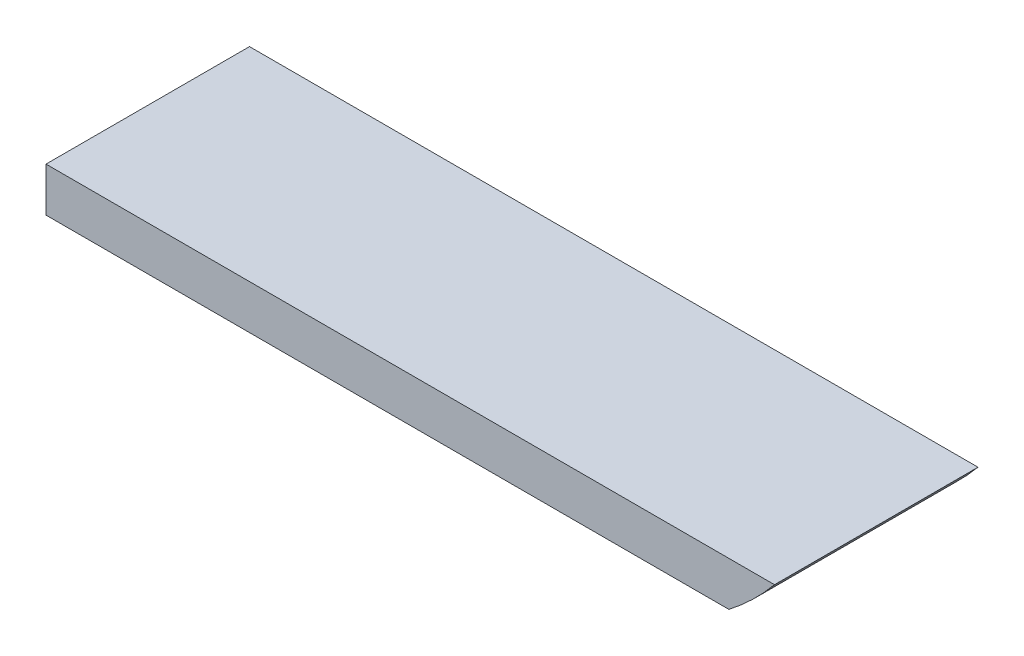
ISO-10303-21;
HEADER;
FILE_DESCRIPTION(('STEP AP214'),'2;1');
FILE_NAME('part.step','',(''),(''),'','','');
FILE_SCHEMA(('AUTOMOTIVE_DESIGN { 1 0 10303 214 1 1 1 1 }'));
ENDSEC;
DATA;
#1=APPLICATION_CONTEXT('core data for automotive mechanical design processes');
#2=APPLICATION_PROTOCOL_DEFINITION('international standard','automotive_design',2000,#1);
#3=PRODUCT_CONTEXT('',#1,'mechanical');
#4=PRODUCT('Part','Part','',(#3));
#5=PRODUCT_RELATED_PRODUCT_CATEGORY('part','',(#4));
#6=PRODUCT_DEFINITION_FORMATION('','',#4);
#7=PRODUCT_DEFINITION_CONTEXT('part definition',#1,'design');
#8=PRODUCT_DEFINITION('design','',#6,#7);
#9=PRODUCT_DEFINITION_SHAPE('','',#8);
#10=(LENGTH_UNIT() NAMED_UNIT(*) SI_UNIT(.MILLI.,.METRE.));
#11=(NAMED_UNIT(*) PLANE_ANGLE_UNIT() SI_UNIT($,.RADIAN.));
#12=(NAMED_UNIT(*) SI_UNIT($,.STERADIAN.) SOLID_ANGLE_UNIT());
#13=UNCERTAINTY_MEASURE_WITH_UNIT(LENGTH_MEASURE(1.E-05),#10,'distance_accuracy_value','');
#14=(GEOMETRIC_REPRESENTATION_CONTEXT(3) GLOBAL_UNCERTAINTY_ASSIGNED_CONTEXT((#13)) GLOBAL_UNIT_ASSIGNED_CONTEXT((#10,
#11,#12)) REPRESENTATION_CONTEXT('',''));
#15=CARTESIAN_POINT('',(0.,0.,0.));
#16=DIRECTION('',(0.,0.,1.));
#17=DIRECTION('',(1.,0.,0.));
#18=AXIS2_PLACEMENT_3D('',#15,#16,#17);
#19=CARTESIAN_POINT('',(-27.120912466168,5.900026226117,0.));
#20=DIRECTION('',(0.,-1.,0.));
#21=DIRECTION('',(1.,0.,0.));
#22=AXIS2_PLACEMENT_3D('',#19,#20,#21);
#23=PLANE('',#22);
#24=DIRECTION('',(-1.,0.,0.));
#25=VECTOR('',#24,1.);
#26=CARTESIAN_POINT('',(-26.785327658729,5.900026226117,0.));
#27=LINE('',#26,#25);
#28=CARTESIAN_POINT('',(-26.785327658729,5.900026226117,0.));
#29=VERTEX_POINT('',#28);
#30=CARTESIAN_POINT('',(-27.120912466168,5.900026226117,0.));
#31=VERTEX_POINT('',#30);
#32=EDGE_CURVE('E11',#29,#31,#27,.T.);
#33=ORIENTED_EDGE('',*,*,#32,.F.);
#34=DIRECTION('',(0.,0.,1.));
#35=VECTOR('',#34,1.);
#36=CARTESIAN_POINT('',(-26.785327658729,5.900026226117,0.));
#37=LINE('',#36,#35);
#38=CARTESIAN_POINT('',(-26.785327658729,5.900026226117,0.1));
#39=VERTEX_POINT('',#38);
#40=EDGE_CURVE('E24',#29,#39,#37,.T.);
#41=ORIENTED_EDGE('',*,*,#40,.T.);
#42=DIRECTION('',(1.,0.,0.));
#43=VECTOR('',#42,1.);
#44=CARTESIAN_POINT('',(-26.785327658729,5.900026226117,0.1));
#45=LINE('',#44,#43);
#46=CARTESIAN_POINT('',(-27.120912466168,5.900026226117,0.1));
#47=VERTEX_POINT('',#46);
#48=EDGE_CURVE('E75',#47,#39,#45,.T.);
#49=ORIENTED_EDGE('',*,*,#48,.F.);
#50=DIRECTION('',(0.,0.,1.));
#51=VECTOR('',#50,1.);
#52=CARTESIAN_POINT('',(-27.120912466168,5.900026226117,0.));
#53=LINE('',#52,#51);
#54=EDGE_CURVE('E85',#31,#47,#53,.T.);
#55=ORIENTED_EDGE('',*,*,#54,.F.);
#56=EDGE_LOOP('',(#33,#41,#49,#55));
#57=FACE_BOUND('',#56,.T.);
#58=ADVANCED_FACE('F17',(#57),#23,.T.);
#59=CARTESIAN_POINT('',(-27.120912466168,5.921755362914,0.));
#60=DIRECTION('',(-1.,0.,0.));
#61=DIRECTION('',(0.,-1.,0.));
#62=AXIS2_PLACEMENT_3D('',#59,#60,#61);
#63=PLANE('',#62);
#64=DIRECTION('',(0.,1.,0.));
#65=VECTOR('',#64,1.);
#66=CARTESIAN_POINT('',(-27.120912466168,5.900026226117,0.));
#67=LINE('',#66,#65);
#68=CARTESIAN_POINT('',(-27.120912466168,5.921755362914,0.));
#69=VERTEX_POINT('',#68);
#70=EDGE_CURVE('E83',#31,#69,#67,.T.);
#71=ORIENTED_EDGE('',*,*,#70,.F.);
#72=ORIENTED_EDGE('',*,*,#54,.T.);
#73=DIRECTION('',(0.,-1.,0.));
#74=VECTOR('',#73,1.);
#75=CARTESIAN_POINT('',(-27.120912466168,5.900026226117,0.1));
#76=LINE('',#75,#74);
#77=CARTESIAN_POINT('',(-27.120912466168,5.921755362914,0.1));
#78=VERTEX_POINT('',#77);
#79=EDGE_CURVE('E81',#78,#47,#76,.T.);
#80=ORIENTED_EDGE('',*,*,#79,.F.);
#81=DIRECTION('',(0.,0.,1.));
#82=VECTOR('',#81,1.);
#83=CARTESIAN_POINT('',(-27.120912466168,5.921755362914,0.));
#84=LINE('',#83,#82);
#85=EDGE_CURVE('E61',#69,#78,#84,.T.);
#86=ORIENTED_EDGE('',*,*,#85,.F.);
#87=EDGE_LOOP('',(#71,#72,#80,#86));
#88=FACE_BOUND('',#87,.T.);
#89=ADVANCED_FACE('F91',(#88),#63,.T.);
#90=CARTESIAN_POINT('',(-26.762905966638,5.921755362914,0.));
#91=DIRECTION('',(0.,1.,0.));
#92=DIRECTION('',(-1.,0.,0.));
#93=AXIS2_PLACEMENT_3D('',#90,#91,#92);
#94=PLANE('',#93);
#95=DIRECTION('',(1.,0.,0.));
#96=VECTOR('',#95,1.);
#97=CARTESIAN_POINT('',(-27.120912466168,5.921755362914,0.));
#98=LINE('',#97,#96);
#99=CARTESIAN_POINT('',(-26.762905966638,5.921755362914,0.));
#100=VERTEX_POINT('',#99);
#101=EDGE_CURVE('E65',#69,#100,#98,.T.);
#102=ORIENTED_EDGE('',*,*,#101,.F.);
#103=ORIENTED_EDGE('',*,*,#85,.T.);
#104=DIRECTION('',(-1.,0.,0.));
#105=VECTOR('',#104,1.);
#106=CARTESIAN_POINT('',(-27.120912466168,5.921755362914,0.1));
#107=LINE('',#106,#105);
#108=CARTESIAN_POINT('',(-26.762905966638,5.921755362914,0.1));
#109=VERTEX_POINT('',#108);
#110=EDGE_CURVE('E54',#109,#78,#107,.T.);
#111=ORIENTED_EDGE('',*,*,#110,.F.);
#112=DIRECTION('',(0.,0.,1.));
#113=VECTOR('',#112,1.);
#114=CARTESIAN_POINT('',(-26.762905966638,5.921755362914,0.));
#115=LINE('',#114,#113);
#116=EDGE_CURVE('E58',#100,#109,#115,.T.);
#117=ORIENTED_EDGE('',*,*,#116,.F.);
#118=EDGE_LOOP('',(#102,#103,#111,#117));
#119=FACE_BOUND('',#118,.T.);
#120=ADVANCED_FACE('F57',(#119),#94,.T.);
#121=CARTESIAN_POINT('',(-26.871812170946,6.011699918327,0.));
#122=DIRECTION('',(0.,0.,1.));
#123=DIRECTION('',(-0.612294741404356,0.790629590673517,0.));
#124=AXIS2_PLACEMENT_3D('',#121,#122,#123);
#125=CYLINDRICAL_SURFACE('',#124,0.141246537604029);
#126=CARTESIAN_POINT('',(-26.871812170946,6.011699918327,0.));
#127=DIRECTION('',(0.,0.,-1.));
#128=DIRECTION('',(-0.612294741404356,0.790629590673517,0.));
#129=AXIS2_PLACEMENT_3D('',#126,#127,#128);
#130=CIRCLE('',#129,0.141246537604029);
#131=EDGE_CURVE('E71',#100,#29,#130,.T.);
#132=ORIENTED_EDGE('',*,*,#131,.F.);
#133=ORIENTED_EDGE('',*,*,#116,.T.);
#134=CARTESIAN_POINT('',(-26.871812170946,6.011699918327,0.1));
#135=DIRECTION('',(0.,0.,1.));
#136=DIRECTION('',(-0.612294741404356,0.790629590673517,0.));
#137=AXIS2_PLACEMENT_3D('',#134,#135,#136);
#138=CIRCLE('',#137,0.141246537604029);
#139=EDGE_CURVE('E70',#39,#109,#138,.T.);
#140=ORIENTED_EDGE('',*,*,#139,.F.);
#141=ORIENTED_EDGE('',*,*,#40,.F.);
#142=EDGE_LOOP('',(#132,#133,#140,#141));
#143=FACE_BOUND('',#142,.T.);
#144=ADVANCED_FACE('F69',(#143),#125,.T.);
#145=CARTESIAN_POINT('',(-26.946924270916,5.911207371001,0.));
#146=DIRECTION('',(0.,0.,1.));
#147=DIRECTION('',(1.,0.,0.));
#148=AXIS2_PLACEMENT_3D('',#145,#146,#147);
#149=PLANE('',#148);
#150=ORIENTED_EDGE('',*,*,#131,.T.);
#151=ORIENTED_EDGE('',*,*,#32,.T.);
#152=ORIENTED_EDGE('',*,*,#70,.T.);
#153=ORIENTED_EDGE('',*,*,#101,.T.);
#154=EDGE_LOOP('',(#150,#151,#152,#153));
#155=FACE_BOUND('',#154,.T.);
#156=ADVANCED_FACE('F88',(#155),#149,.F.);
#157=CARTESIAN_POINT('',(-26.946924270916,5.911207371001,0.1));
#158=DIRECTION('',(0.,0.,1.));
#159=DIRECTION('',(1.,0.,0.));
#160=AXIS2_PLACEMENT_3D('',#157,#158,#159);
#161=PLANE('',#160);
#162=ORIENTED_EDGE('',*,*,#139,.T.);
#163=ORIENTED_EDGE('',*,*,#110,.T.);
#164=ORIENTED_EDGE('',*,*,#79,.T.);
#165=ORIENTED_EDGE('',*,*,#48,.T.);
#166=EDGE_LOOP('',(#162,#163,#164,#165));
#167=FACE_BOUND('',#166,.T.);
#168=ADVANCED_FACE('F74',(#167),#161,.T.);
#169=CLOSED_SHELL('',(#58,#89,#120,#144,#156,#168));
#170=MANIFOLD_SOLID_BREP('B1',#169);
#171=ADVANCED_BREP_SHAPE_REPRESENTATION('',(#18,#170),#14);
#172=SHAPE_DEFINITION_REPRESENTATION(#9,#171);
ENDSEC;
END-ISO-10303-21;
